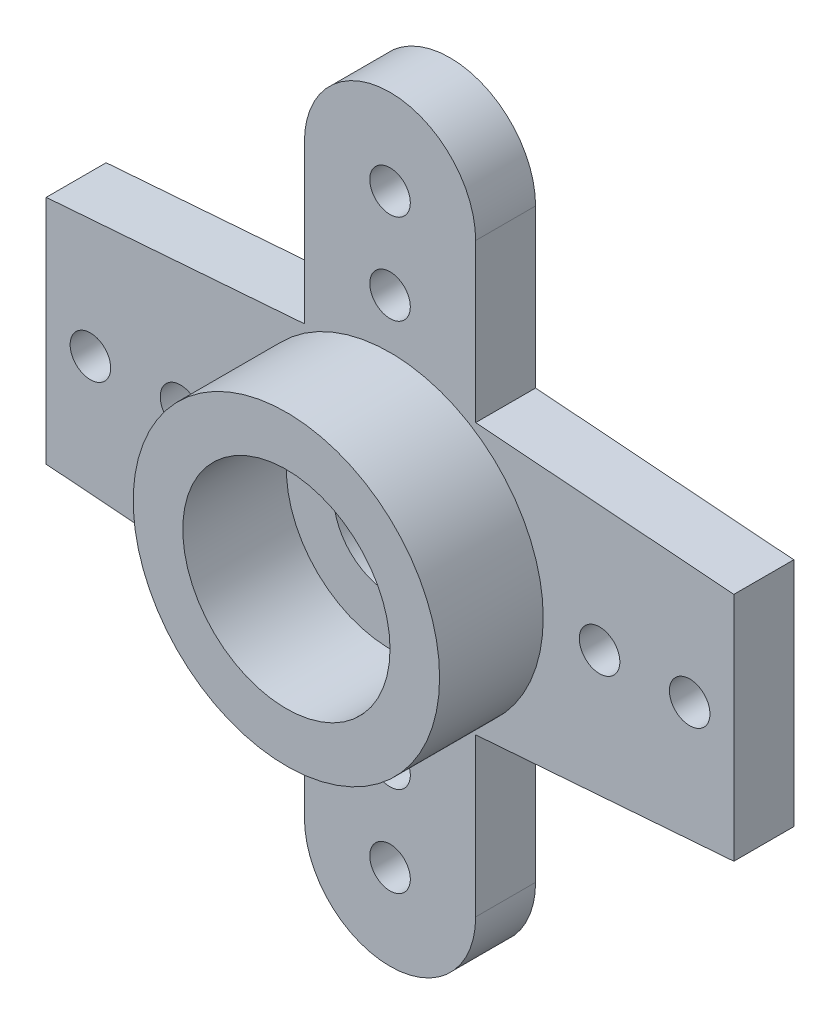
ISO-10303-21;
HEADER;
FILE_DESCRIPTION(('STEP AP214'),'2;1');
FILE_NAME('part.step','',(''),(''),'','','');
FILE_SCHEMA(('AUTOMOTIVE_DESIGN { 1 0 10303 214 1 1 1 1 }'));
ENDSEC;
DATA;
#1=APPLICATION_CONTEXT('core data for automotive mechanical design processes');
#2=APPLICATION_PROTOCOL_DEFINITION('international standard','automotive_design',2000,#1);
#3=PRODUCT_CONTEXT('',#1,'mechanical');
#4=PRODUCT('Part','Part','',(#3));
#5=PRODUCT_RELATED_PRODUCT_CATEGORY('part','',(#4));
#6=PRODUCT_DEFINITION_FORMATION('','',#4);
#7=PRODUCT_DEFINITION_CONTEXT('part definition',#1,'design');
#8=PRODUCT_DEFINITION('design','',#6,#7);
#9=PRODUCT_DEFINITION_SHAPE('','',#8);
#10=(LENGTH_UNIT() NAMED_UNIT(*) SI_UNIT(.MILLI.,.METRE.));
#11=(NAMED_UNIT(*) PLANE_ANGLE_UNIT() SI_UNIT($,.RADIAN.));
#12=(NAMED_UNIT(*) SI_UNIT($,.STERADIAN.) SOLID_ANGLE_UNIT());
#13=UNCERTAINTY_MEASURE_WITH_UNIT(LENGTH_MEASURE(1.E-05),#10,'distance_accuracy_value','');
#14=(GEOMETRIC_REPRESENTATION_CONTEXT(3) GLOBAL_UNCERTAINTY_ASSIGNED_CONTEXT((#13)) GLOBAL_UNIT_ASSIGNED_CONTEXT((#10,
#11,#12)) REPRESENTATION_CONTEXT('',''));
#15=CARTESIAN_POINT('',(0.,0.,0.));
#16=DIRECTION('',(0.,0.,1.));
#17=DIRECTION('',(1.,0.,0.));
#18=AXIS2_PLACEMENT_3D('',#15,#16,#17);
#19=CARTESIAN_POINT('',(0.,0.,0.));
#20=DIRECTION('',(0.,0.,1.));
#21=DIRECTION('',(1.,0.,0.));
#22=AXIS2_PLACEMENT_3D('',#19,#20,#21);
#23=CYLINDRICAL_SURFACE('',#22,1.25);
#24=CARTESIAN_POINT('',(0.,0.,1.33));
#25=DIRECTION('',(0.,0.,1.));
#26=DIRECTION('',(1.,0.,0.));
#27=AXIS2_PLACEMENT_3D('',#24,#25,#26);
#28=CIRCLE('',#27,1.25);
#29=CARTESIAN_POINT('',(1.25,0.,1.33));
#30=VERTEX_POINT('',#29);
#31=EDGE_CURVE('E353',#30,#30,#28,.T.);
#32=ORIENTED_EDGE('',*,*,#31,.T.);
#33=EDGE_LOOP('',(#32));
#34=FACE_BOUND('',#33,.T.);
#35=CARTESIAN_POINT('',(0.,0.,1.1));
#36=DIRECTION('',(0.,0.,-1.));
#37=DIRECTION('',(-1.,0.,0.));
#38=AXIS2_PLACEMENT_3D('',#35,#36,#37);
#39=CIRCLE('',#38,1.25);
#40=CARTESIAN_POINT('',(-1.25,0.,1.1));
#41=VERTEX_POINT('',#40);
#42=EDGE_CURVE('E43',#41,#41,#39,.F.);
#43=ORIENTED_EDGE('',*,*,#42,.F.);
#44=EDGE_LOOP('',(#43));
#45=FACE_BOUND('',#44,.T.);
#46=ADVANCED_FACE('F39',(#34,#45),#23,.F.);
#47=CARTESIAN_POINT('',(-16.7919145803729,-1.86962168683336,1.33));
#48=DIRECTION('',(0.0756877761988721,0.997131566311121,0.));
#49=DIRECTION('',(-0.997131566311121,0.0756877761988721,0.));
#50=AXIS2_PLACEMENT_3D('',#47,#48,#49);
#51=PLANE('',#50);
#52=DIRECTION('',(0.997131566311121,-0.0756877761988721,0.));
#53=VECTOR('',#52,1.);
#54=CARTESIAN_POINT('',(-16.7919145803729,-1.86962168683336,1.33));
#55=LINE('',#54,#53);
#56=CARTESIAN_POINT('',(-7.63066165400287,-2.56501122680907,1.33));
#57=VERTEX_POINT('',#56);
#58=CARTESIAN_POINT('',(-1.90000000000001,-3.,1.33));
#59=VERTEX_POINT('',#58);
#60=EDGE_CURVE('E175',#57,#59,#55,.T.);
#61=ORIENTED_EDGE('',*,*,#60,.F.);
#62=DIRECTION('',(0.,0.,-1.));
#63=VECTOR('',#62,1.);
#64=CARTESIAN_POINT('',(-7.63066165400287,-2.56501122680907,1.33));
#65=LINE('',#64,#63);
#66=CARTESIAN_POINT('',(-7.63066165400287,-2.56501122680907,0.));
#67=VERTEX_POINT('',#66);
#68=EDGE_CURVE('E149',#57,#67,#65,.T.);
#69=ORIENTED_EDGE('',*,*,#68,.T.);
#70=DIRECTION('',(0.997131566311121,-0.0756877761988721,0.));
#71=VECTOR('',#70,1.);
#72=CARTESIAN_POINT('',(-16.7919145803729,-1.86962168683336,0.));
#73=LINE('',#72,#71);
#74=CARTESIAN_POINT('',(-1.90000000000001,-3.,0.));
#75=VERTEX_POINT('',#74);
#76=EDGE_CURVE('E217',#67,#75,#73,.T.);
#77=ORIENTED_EDGE('',*,*,#76,.T.);
#78=DIRECTION('',(0.,0.,-1.));
#79=VECTOR('',#78,1.);
#80=CARTESIAN_POINT('',(-1.90000000000001,-3.,1.33));
#81=LINE('',#80,#79);
#82=EDGE_CURVE('E49',#59,#75,#81,.T.);
#83=ORIENTED_EDGE('',*,*,#82,.F.);
#84=EDGE_LOOP('',(#61,#69,#77,#83));
#85=FACE_BOUND('',#84,.T.);
#86=ADVANCED_FACE('F41',(#85),#51,.F.);
#87=CARTESIAN_POINT('',(-1.90000000000001,-3.,1.33));
#88=DIRECTION('',(1.,0.,0.));
#89=DIRECTION('',(0.,1.,0.));
#90=AXIS2_PLACEMENT_3D('',#87,#88,#89);
#91=PLANE('',#90);
#92=DIRECTION('',(0.,-1.,0.));
#93=VECTOR('',#92,1.);
#94=CARTESIAN_POINT('',(-1.90000000000001,-3.,0.));
#95=LINE('',#94,#93);
#96=CARTESIAN_POINT('',(-1.9,-6.5,0.));
#97=VERTEX_POINT('',#96);
#98=EDGE_CURVE('E211',#75,#97,#95,.T.);
#99=ORIENTED_EDGE('',*,*,#98,.T.);
#100=DIRECTION('',(0.,0.,-1.));
#101=VECTOR('',#100,1.);
#102=CARTESIAN_POINT('',(-1.9,-6.5,1.33));
#103=LINE('',#102,#101);
#104=CARTESIAN_POINT('',(-1.9,-6.5,1.33));
#105=VERTEX_POINT('',#104);
#106=EDGE_CURVE('E200',#105,#97,#103,.T.);
#107=ORIENTED_EDGE('',*,*,#106,.F.);
#108=DIRECTION('',(0.,-1.,0.));
#109=VECTOR('',#108,1.);
#110=CARTESIAN_POINT('',(-1.90000000000001,-3.,1.33));
#111=LINE('',#110,#109);
#112=EDGE_CURVE('E212',#59,#105,#111,.T.);
#113=ORIENTED_EDGE('',*,*,#112,.F.);
#114=ORIENTED_EDGE('',*,*,#82,.T.);
#115=EDGE_LOOP('',(#99,#107,#113,#114));
#116=FACE_BOUND('',#115,.T.);
#117=ADVANCED_FACE('F209',(#116),#91,.F.);
#118=CARTESIAN_POINT('',(0.,-6.5,1.33));
#119=DIRECTION('',(0.,0.,-1.));
#120=DIRECTION('',(-1.,0.,0.));
#121=AXIS2_PLACEMENT_3D('',#118,#119,#120);
#122=CYLINDRICAL_SURFACE('',#121,1.9);
#123=CARTESIAN_POINT('',(0.,-6.5,0.));
#124=DIRECTION('',(0.,0.,1.));
#125=DIRECTION('',(-1.,0.,0.));
#126=AXIS2_PLACEMENT_3D('',#123,#124,#125);
#127=CIRCLE('',#126,1.9);
#128=CARTESIAN_POINT('',(1.9,-6.5,0.));
#129=VERTEX_POINT('',#128);
#130=EDGE_CURVE('E219',#97,#129,#127,.T.);
#131=ORIENTED_EDGE('',*,*,#130,.T.);
#132=DIRECTION('',(0.,0.,-1.));
#133=VECTOR('',#132,1.);
#134=CARTESIAN_POINT('',(1.9,-6.5,1.33));
#135=LINE('',#134,#133);
#136=CARTESIAN_POINT('',(1.9,-6.5,1.33));
#137=VERTEX_POINT('',#136);
#138=EDGE_CURVE('E196',#137,#129,#135,.T.);
#139=ORIENTED_EDGE('',*,*,#138,.F.);
#140=CARTESIAN_POINT('',(0.,-6.5,1.33));
#141=DIRECTION('',(0.,0.,1.));
#142=DIRECTION('',(-1.,0.,0.));
#143=AXIS2_PLACEMENT_3D('',#140,#141,#142);
#144=CIRCLE('',#143,1.9);
#145=EDGE_CURVE('E247',#105,#137,#144,.T.);
#146=ORIENTED_EDGE('',*,*,#145,.F.);
#147=ORIENTED_EDGE('',*,*,#106,.T.);
#148=EDGE_LOOP('',(#131,#139,#146,#147));
#149=FACE_BOUND('',#148,.T.);
#150=ADVANCED_FACE('F374',(#149),#122,.T.);
#151=CARTESIAN_POINT('',(1.89999999999999,-3.,1.33));
#152=DIRECTION('',(-1.,0.,0.));
#153=DIRECTION('',(0.,-1.,0.));
#154=AXIS2_PLACEMENT_3D('',#151,#152,#153);
#155=PLANE('',#154);
#156=DIRECTION('',(0.,1.,0.));
#157=VECTOR('',#156,1.);
#158=CARTESIAN_POINT('',(1.89999999999999,-3.,0.));
#159=LINE('',#158,#157);
#160=CARTESIAN_POINT('',(1.89999999999999,-3.,0.));
#161=VERTEX_POINT('',#160);
#162=EDGE_CURVE('E162',#129,#161,#159,.T.);
#163=ORIENTED_EDGE('',*,*,#162,.T.);
#164=DIRECTION('',(0.,0.,-1.));
#165=VECTOR('',#164,1.);
#166=CARTESIAN_POINT('',(1.89999999999999,-3.,1.33));
#167=LINE('',#166,#165);
#168=CARTESIAN_POINT('',(1.89999999999999,-3.,1.33));
#169=VERTEX_POINT('',#168);
#170=EDGE_CURVE('E192',#169,#161,#167,.T.);
#171=ORIENTED_EDGE('',*,*,#170,.F.);
#172=DIRECTION('',(0.,1.,0.));
#173=VECTOR('',#172,1.);
#174=CARTESIAN_POINT('',(1.89999999999999,-3.,1.33));
#175=LINE('',#174,#173);
#176=EDGE_CURVE('E241',#137,#169,#175,.T.);
#177=ORIENTED_EDGE('',*,*,#176,.F.);
#178=ORIENTED_EDGE('',*,*,#138,.T.);
#179=EDGE_LOOP('',(#163,#171,#177,#178));
#180=FACE_BOUND('',#179,.T.);
#181=ADVANCED_FACE('F231',(#180),#155,.F.);
#182=CARTESIAN_POINT('',(16.7919145803729,-1.86962168683335,1.33));
#183=DIRECTION('',(-0.0756877761988722,0.997131566311121,0.));
#184=DIRECTION('',(-0.997131566311121,-0.0756877761988722,0.));
#185=AXIS2_PLACEMENT_3D('',#182,#183,#184);
#186=PLANE('',#185);
#187=DIRECTION('',(0.997131566311121,0.0756877761988722,0.));
#188=VECTOR('',#187,1.);
#189=CARTESIAN_POINT('',(16.7919145803729,-1.86962168683335,0.));
#190=LINE('',#189,#188);
#191=CARTESIAN_POINT('',(7.63066165400287,-2.56501122680907,0.));
#192=VERTEX_POINT('',#191);
#193=EDGE_CURVE('E156',#161,#192,#190,.T.);
#194=ORIENTED_EDGE('',*,*,#193,.T.);
#195=DIRECTION('',(0.,0.,1.));
#196=VECTOR('',#195,1.);
#197=CARTESIAN_POINT('',(7.63066165400287,-2.56501122680907,1.33));
#198=LINE('',#197,#196);
#199=CARTESIAN_POINT('',(7.63066165400287,-2.56501122680907,1.33));
#200=VERTEX_POINT('',#199);
#201=EDGE_CURVE('E57',#192,#200,#198,.T.);
#202=ORIENTED_EDGE('',*,*,#201,.T.);
#203=DIRECTION('',(0.997131566311121,0.0756877761988722,0.));
#204=VECTOR('',#203,1.);
#205=CARTESIAN_POINT('',(16.7919145803729,-1.86962168683335,1.33));
#206=LINE('',#205,#204);
#207=EDGE_CURVE('E238',#169,#200,#206,.T.);
#208=ORIENTED_EDGE('',*,*,#207,.F.);
#209=ORIENTED_EDGE('',*,*,#170,.T.);
#210=EDGE_LOOP('',(#194,#202,#208,#209));
#211=FACE_BOUND('',#210,.T.);
#212=ADVANCED_FACE('F236',(#211),#186,.F.);
#213=CARTESIAN_POINT('',(16.7919145803729,1.86962168683335,1.33));
#214=DIRECTION('',(-0.0756877761988718,-0.997131566311121,0.));
#215=DIRECTION('',(0.997131566311121,-0.0756877761988718,0.));
#216=AXIS2_PLACEMENT_3D('',#213,#214,#215);
#217=PLANE('',#216);
#218=DIRECTION('',(-0.997131566311121,0.0756877761988718,0.));
#219=VECTOR('',#218,1.);
#220=CARTESIAN_POINT('',(16.7919145803729,1.86962168683335,1.33));
#221=LINE('',#220,#219);
#222=CARTESIAN_POINT('',(7.63066165400287,2.56501122680907,1.33));
#223=VERTEX_POINT('',#222);
#224=CARTESIAN_POINT('',(1.89999999999999,3.,1.33));
#225=VERTEX_POINT('',#224);
#226=EDGE_CURVE('E147',#223,#225,#221,.T.);
#227=ORIENTED_EDGE('',*,*,#226,.F.);
#228=DIRECTION('',(0.,0.,-1.));
#229=VECTOR('',#228,1.);
#230=CARTESIAN_POINT('',(7.63066165400287,2.56501122680907,1.33));
#231=LINE('',#230,#229);
#232=CARTESIAN_POINT('',(7.63066165400287,2.56501122680906,0.));
#233=VERTEX_POINT('',#232);
#234=EDGE_CURVE('E131',#223,#233,#231,.T.);
#235=ORIENTED_EDGE('',*,*,#234,.T.);
#236=DIRECTION('',(-0.997131566311121,0.0756877761988718,0.));
#237=VECTOR('',#236,1.);
#238=CARTESIAN_POINT('',(16.7919145803729,1.86962168683335,0.));
#239=LINE('',#238,#237);
#240=CARTESIAN_POINT('',(1.89999999999999,3.,0.));
#241=VERTEX_POINT('',#240);
#242=EDGE_CURVE('E145',#233,#241,#239,.T.);
#243=ORIENTED_EDGE('',*,*,#242,.T.);
#244=DIRECTION('',(0.,0.,-1.));
#245=VECTOR('',#244,1.);
#246=CARTESIAN_POINT('',(1.89999999999999,3.,1.33));
#247=LINE('',#246,#245);
#248=EDGE_CURVE('E189',#225,#241,#247,.T.);
#249=ORIENTED_EDGE('',*,*,#248,.F.);
#250=EDGE_LOOP('',(#227,#235,#243,#249));
#251=FACE_BOUND('',#250,.T.);
#252=ADVANCED_FACE('F143',(#251),#217,.F.);
#253=CARTESIAN_POINT('',(1.89999999999999,3.,1.33));
#254=DIRECTION('',(-1.,0.,0.));
#255=DIRECTION('',(0.,-1.,0.));
#256=AXIS2_PLACEMENT_3D('',#253,#254,#255);
#257=PLANE('',#256);
#258=DIRECTION('',(0.,1.,0.));
#259=VECTOR('',#258,1.);
#260=CARTESIAN_POINT('',(1.89999999999999,3.,0.));
#261=LINE('',#260,#259);
#262=CARTESIAN_POINT('',(1.9,6.5,0.));
#263=VERTEX_POINT('',#262);
#264=EDGE_CURVE('E154',#241,#263,#261,.T.);
#265=ORIENTED_EDGE('',*,*,#264,.T.);
#266=DIRECTION('',(0.,0.,-1.));
#267=VECTOR('',#266,1.);
#268=CARTESIAN_POINT('',(1.9,6.5,1.33));
#269=LINE('',#268,#267);
#270=CARTESIAN_POINT('',(1.9,6.5,1.33));
#271=VERTEX_POINT('',#270);
#272=EDGE_CURVE('E185',#271,#263,#269,.T.);
#273=ORIENTED_EDGE('',*,*,#272,.F.);
#274=DIRECTION('',(0.,1.,0.));
#275=VECTOR('',#274,1.);
#276=CARTESIAN_POINT('',(1.89999999999999,3.,1.33));
#277=LINE('',#276,#275);
#278=EDGE_CURVE('E245',#225,#271,#277,.T.);
#279=ORIENTED_EDGE('',*,*,#278,.F.);
#280=ORIENTED_EDGE('',*,*,#248,.T.);
#281=EDGE_LOOP('',(#265,#273,#279,#280));
#282=FACE_BOUND('',#281,.T.);
#283=ADVANCED_FACE('F421',(#282),#257,.F.);
#284=CARTESIAN_POINT('',(0.,6.5,1.33));
#285=DIRECTION('',(0.,0.,-1.));
#286=DIRECTION('',(-1.,0.,0.));
#287=AXIS2_PLACEMENT_3D('',#284,#285,#286);
#288=CYLINDRICAL_SURFACE('',#287,1.9);
#289=CARTESIAN_POINT('',(0.,6.5,0.));
#290=DIRECTION('',(0.,0.,1.));
#291=DIRECTION('',(1.,0.,0.));
#292=AXIS2_PLACEMENT_3D('',#289,#290,#291);
#293=CIRCLE('',#292,1.9);
#294=CARTESIAN_POINT('',(-1.9,6.5,0.));
#295=VERTEX_POINT('',#294);
#296=EDGE_CURVE('E160',#263,#295,#293,.T.);
#297=ORIENTED_EDGE('',*,*,#296,.T.);
#298=DIRECTION('',(0.,0.,-1.));
#299=VECTOR('',#298,1.);
#300=CARTESIAN_POINT('',(-1.9,6.5,1.33));
#301=LINE('',#300,#299);
#302=CARTESIAN_POINT('',(-1.9,6.5,1.33));
#303=VERTEX_POINT('',#302);
#304=EDGE_CURVE('E180',#303,#295,#301,.T.);
#305=ORIENTED_EDGE('',*,*,#304,.F.);
#306=CARTESIAN_POINT('',(0.,6.5,1.33));
#307=DIRECTION('',(0.,0.,1.));
#308=DIRECTION('',(1.,0.,0.));
#309=AXIS2_PLACEMENT_3D('',#306,#307,#308);
#310=CIRCLE('',#309,1.9);
#311=EDGE_CURVE('E253',#271,#303,#310,.T.);
#312=ORIENTED_EDGE('',*,*,#311,.F.);
#313=ORIENTED_EDGE('',*,*,#272,.T.);
#314=EDGE_LOOP('',(#297,#305,#312,#313));
#315=FACE_BOUND('',#314,.T.);
#316=ADVANCED_FACE('F417',(#315),#288,.T.);
#317=CARTESIAN_POINT('',(-1.90000000000001,3.,1.33));
#318=DIRECTION('',(1.,0.,0.));
#319=DIRECTION('',(0.,1.,0.));
#320=AXIS2_PLACEMENT_3D('',#317,#318,#319);
#321=PLANE('',#320);
#322=DIRECTION('',(0.,-1.,0.));
#323=VECTOR('',#322,1.);
#324=CARTESIAN_POINT('',(-1.90000000000001,3.,0.));
#325=LINE('',#324,#323);
#326=CARTESIAN_POINT('',(-1.90000000000001,3.,0.));
#327=VERTEX_POINT('',#326);
#328=EDGE_CURVE('E168',#295,#327,#325,.T.);
#329=ORIENTED_EDGE('',*,*,#328,.T.);
#330=DIRECTION('',(0.,0.,-1.));
#331=VECTOR('',#330,1.);
#332=CARTESIAN_POINT('',(-1.90000000000001,3.,1.33));
#333=LINE('',#332,#331);
#334=CARTESIAN_POINT('',(-1.90000000000001,3.,1.33));
#335=VERTEX_POINT('',#334);
#336=EDGE_CURVE('E176',#335,#327,#333,.T.);
#337=ORIENTED_EDGE('',*,*,#336,.F.);
#338=DIRECTION('',(0.,-1.,0.));
#339=VECTOR('',#338,1.);
#340=CARTESIAN_POINT('',(-1.90000000000001,3.,1.33));
#341=LINE('',#340,#339);
#342=EDGE_CURVE('E256',#303,#335,#341,.T.);
#343=ORIENTED_EDGE('',*,*,#342,.F.);
#344=ORIENTED_EDGE('',*,*,#304,.T.);
#345=EDGE_LOOP('',(#329,#337,#343,#344));
#346=FACE_BOUND('',#345,.T.);
#347=ADVANCED_FACE('F414',(#346),#321,.F.);
#348=CARTESIAN_POINT('',(-16.7919145803729,1.86962168683335,1.33));
#349=DIRECTION('',(0.0756877761988721,-0.997131566311121,0.));
#350=DIRECTION('',(0.997131566311121,0.0756877761988721,0.));
#351=AXIS2_PLACEMENT_3D('',#348,#349,#350);
#352=PLANE('',#351);
#353=DIRECTION('',(-0.997131566311121,-0.0756877761988721,0.));
#354=VECTOR('',#353,1.);
#355=CARTESIAN_POINT('',(-16.7919145803729,1.86962168683335,0.));
#356=LINE('',#355,#354);
#357=CARTESIAN_POINT('',(-7.63066165400287,2.56501122680906,0.));
#358=VERTEX_POINT('',#357);
#359=EDGE_CURVE('E171',#327,#358,#356,.T.);
#360=ORIENTED_EDGE('',*,*,#359,.T.);
#361=DIRECTION('',(0.,0.,1.));
#362=VECTOR('',#361,1.);
#363=CARTESIAN_POINT('',(-7.63066165400287,2.56501122680906,1.33));
#364=LINE('',#363,#362);
#365=CARTESIAN_POINT('',(-7.63066165400287,2.56501122680906,1.33));
#366=VERTEX_POINT('',#365);
#367=EDGE_CURVE('E65',#358,#366,#364,.T.);
#368=ORIENTED_EDGE('',*,*,#367,.T.);
#369=DIRECTION('',(-0.997131566311121,-0.0756877761988721,0.));
#370=VECTOR('',#369,1.);
#371=CARTESIAN_POINT('',(-16.7919145803729,1.86962168683335,1.33));
#372=LINE('',#371,#370);
#373=EDGE_CURVE('E181',#335,#366,#372,.T.);
#374=ORIENTED_EDGE('',*,*,#373,.F.);
#375=ORIENTED_EDGE('',*,*,#336,.T.);
#376=EDGE_LOOP('',(#360,#368,#374,#375));
#377=FACE_BOUND('',#376,.T.);
#378=ADVANCED_FACE('F267',(#377),#352,.F.);
#379=CARTESIAN_POINT('',(-16.65,0.,1.33));
#380=DIRECTION('',(0.,0.,1.));
#381=DIRECTION('',(1.,0.,0.));
#382=AXIS2_PLACEMENT_3D('',#379,#380,#381);
#383=PLANE('',#382);
#384=DIRECTION('',(0.,1.,0.));
#385=VECTOR('',#384,1.);
#386=CARTESIAN_POINT('',(7.63066165400287,-0.0695003417725334,1.33));
#387=LINE('',#386,#385);
#388=EDGE_CURVE('E138',#200,#223,#387,.T.);
#389=ORIENTED_EDGE('',*,*,#388,.T.);
#390=ORIENTED_EDGE('',*,*,#226,.T.);
#391=ORIENTED_EDGE('',*,*,#278,.T.);
#392=ORIENTED_EDGE('',*,*,#311,.T.);
#393=ORIENTED_EDGE('',*,*,#342,.T.);
#394=ORIENTED_EDGE('',*,*,#373,.T.);
#395=DIRECTION('',(0.,-1.,0.));
#396=VECTOR('',#395,1.);
#397=CARTESIAN_POINT('',(-7.63066165400287,-4.01865818135767,1.33));
#398=LINE('',#397,#396);
#399=EDGE_CURVE('E139',#366,#57,#398,.T.);
#400=ORIENTED_EDGE('',*,*,#399,.T.);
#401=ORIENTED_EDGE('',*,*,#60,.T.);
#402=ORIENTED_EDGE('',*,*,#112,.T.);
#403=ORIENTED_EDGE('',*,*,#145,.T.);
#404=ORIENTED_EDGE('',*,*,#176,.T.);
#405=ORIENTED_EDGE('',*,*,#207,.T.);
#406=EDGE_LOOP('',(#389,#390,#391,#392,#393,#394,#400,#401,#402,#403,#404,#405));
#407=FACE_BOUND('',#406,.T.);
#408=CARTESIAN_POINT('',(0.,6.5,1.33));
#409=DIRECTION('',(0.,0.,1.));
#410=DIRECTION('',(1.,0.,0.));
#411=AXIS2_PLACEMENT_3D('',#408,#409,#410);
#412=CIRCLE('',#411,0.45);
#413=CARTESIAN_POINT('',(0.449999999999998,6.5,1.33));
#414=VERTEX_POINT('',#413);
#415=EDGE_CURVE('E287',#414,#414,#412,.T.);
#416=ORIENTED_EDGE('',*,*,#415,.F.);
#417=EDGE_LOOP('',(#416));
#418=FACE_BOUND('',#417,.T.);
#419=CARTESIAN_POINT('',(6.65,0.,1.33));
#420=DIRECTION('',(0.,0.,1.));
#421=DIRECTION('',(-1.,0.,0.));
#422=AXIS2_PLACEMENT_3D('',#419,#420,#421);
#423=CIRCLE('',#422,0.449999999999998);
#424=CARTESIAN_POINT('',(6.20000000000001,0.,1.33));
#425=VERTEX_POINT('',#424);
#426=EDGE_CURVE('E281',#425,#425,#423,.T.);
#427=ORIENTED_EDGE('',*,*,#426,.F.);
#428=EDGE_LOOP('',(#427));
#429=FACE_BOUND('',#428,.T.);
#430=CARTESIAN_POINT('',(4.65,0.,1.33));
#431=DIRECTION('',(0.,0.,1.));
#432=DIRECTION('',(-1.,0.,0.));
#433=AXIS2_PLACEMENT_3D('',#430,#431,#432);
#434=CIRCLE('',#433,0.449999999999998);
#435=CARTESIAN_POINT('',(4.20000000000001,0.,1.33));
#436=VERTEX_POINT('',#435);
#437=EDGE_CURVE('E313',#436,#436,#434,.T.);
#438=ORIENTED_EDGE('',*,*,#437,.F.);
#439=EDGE_LOOP('',(#438));
#440=FACE_BOUND('',#439,.T.);
#441=CARTESIAN_POINT('',(0.,-6.5,1.33));
#442=DIRECTION('',(0.,0.,1.));
#443=DIRECTION('',(-1.,0.,0.));
#444=AXIS2_PLACEMENT_3D('',#441,#442,#443);
#445=CIRCLE('',#444,0.45);
#446=CARTESIAN_POINT('',(-0.449999999999997,-6.5,1.33));
#447=VERTEX_POINT('',#446);
#448=EDGE_CURVE('E305',#447,#447,#445,.T.);
#449=ORIENTED_EDGE('',*,*,#448,.F.);
#450=EDGE_LOOP('',(#449));
#451=FACE_BOUND('',#450,.T.);
#452=CARTESIAN_POINT('',(0.,-4.5,1.33));
#453=DIRECTION('',(0.,0.,1.));
#454=DIRECTION('',(-1.,0.,0.));
#455=AXIS2_PLACEMENT_3D('',#452,#453,#454);
#456=CIRCLE('',#455,0.45);
#457=CARTESIAN_POINT('',(-0.449999999999978,-4.5,1.33));
#458=VERTEX_POINT('',#457);
#459=EDGE_CURVE('E297',#458,#458,#456,.T.);
#460=ORIENTED_EDGE('',*,*,#459,.F.);
#461=EDGE_LOOP('',(#460));
#462=FACE_BOUND('',#461,.T.);
#463=CARTESIAN_POINT('',(0.,4.5,1.33));
#464=DIRECTION('',(0.,0.,1.));
#465=DIRECTION('',(1.,0.,0.));
#466=AXIS2_PLACEMENT_3D('',#463,#464,#465);
#467=CIRCLE('',#466,0.45);
#468=CARTESIAN_POINT('',(0.450000000000019,4.5,1.33));
#469=VERTEX_POINT('',#468);
#470=EDGE_CURVE('E328',#469,#469,#467,.T.);
#471=ORIENTED_EDGE('',*,*,#470,.F.);
#472=EDGE_LOOP('',(#471));
#473=FACE_BOUND('',#472,.T.);
#474=CARTESIAN_POINT('',(-6.65,0.,1.33));
#475=DIRECTION('',(0.,0.,1.));
#476=DIRECTION('',(1.,0.,0.));
#477=AXIS2_PLACEMENT_3D('',#474,#475,#476);
#478=CIRCLE('',#477,0.449999999999998);
#479=CARTESIAN_POINT('',(-6.20000000000001,0.,1.33));
#480=VERTEX_POINT('',#479);
#481=EDGE_CURVE('E329',#480,#480,#478,.T.);
#482=ORIENTED_EDGE('',*,*,#481,.F.);
#483=EDGE_LOOP('',(#482));
#484=FACE_BOUND('',#483,.T.);
#485=CARTESIAN_POINT('',(-4.65,0.,1.33));
#486=DIRECTION('',(0.,0.,1.));
#487=DIRECTION('',(1.,0.,0.));
#488=AXIS2_PLACEMENT_3D('',#485,#486,#487);
#489=CIRCLE('',#488,0.449999999999998);
#490=CARTESIAN_POINT('',(-4.20000000000001,0.,1.33));
#491=VERTEX_POINT('',#490);
#492=EDGE_CURVE('E296',#491,#491,#489,.T.);
#493=ORIENTED_EDGE('',*,*,#492,.F.);
#494=EDGE_LOOP('',(#493));
#495=FACE_BOUND('',#494,.T.);
#496=CARTESIAN_POINT('',(0.,0.,1.33));
#497=DIRECTION('',(0.,0.,1.));
#498=DIRECTION('',(1.,0.,0.));
#499=AXIS2_PLACEMENT_3D('',#496,#497,#498);
#500=CIRCLE('',#499,3.4);
#501=CARTESIAN_POINT('',(3.4,0.,1.33));
#502=VERTEX_POINT('',#501);
#503=EDGE_CURVE('E11',#502,#502,#500,.T.);
#504=ORIENTED_EDGE('',*,*,#503,.F.);
#505=EDGE_LOOP('',(#504));
#506=FACE_BOUND('',#505,.T.);
#507=ADVANCED_FACE('F262',(#407,#418,#429,#440,#451,#462,#473,#484,#495,#506),#383,.T.);
#508=CARTESIAN_POINT('',(-16.65,0.,0.));
#509=DIRECTION('',(0.,0.,1.));
#510=DIRECTION('',(1.,0.,0.));
#511=AXIS2_PLACEMENT_3D('',#508,#509,#510);
#512=PLANE('',#511);
#513=CARTESIAN_POINT('',(0.,6.5,0.));
#514=DIRECTION('',(0.,0.,1.));
#515=DIRECTION('',(1.,0.,0.));
#516=AXIS2_PLACEMENT_3D('',#513,#514,#515);
#517=CIRCLE('',#516,0.45);
#518=CARTESIAN_POINT('',(0.449999999999998,6.5,0.));
#519=VERTEX_POINT('',#518);
#520=EDGE_CURVE('E282',#519,#519,#517,.T.);
#521=ORIENTED_EDGE('',*,*,#520,.T.);
#522=EDGE_LOOP('',(#521));
#523=FACE_BOUND('',#522,.T.);
#524=CARTESIAN_POINT('',(6.65,0.,0.));
#525=DIRECTION('',(0.,0.,1.));
#526=DIRECTION('',(-1.,0.,0.));
#527=AXIS2_PLACEMENT_3D('',#524,#525,#526);
#528=CIRCLE('',#527,0.449999999999998);
#529=CARTESIAN_POINT('',(6.20000000000001,0.,0.));
#530=VERTEX_POINT('',#529);
#531=EDGE_CURVE('E317',#530,#530,#528,.T.);
#532=ORIENTED_EDGE('',*,*,#531,.T.);
#533=EDGE_LOOP('',(#532));
#534=FACE_BOUND('',#533,.T.);
#535=CARTESIAN_POINT('',(4.65,0.,0.));
#536=DIRECTION('',(0.,0.,1.));
#537=DIRECTION('',(-1.,0.,0.));
#538=AXIS2_PLACEMENT_3D('',#535,#536,#537);
#539=CIRCLE('',#538,0.449999999999998);
#540=CARTESIAN_POINT('',(4.20000000000001,0.,0.));
#541=VERTEX_POINT('',#540);
#542=EDGE_CURVE('E309',#541,#541,#539,.T.);
#543=ORIENTED_EDGE('',*,*,#542,.T.);
#544=EDGE_LOOP('',(#543));
#545=FACE_BOUND('',#544,.T.);
#546=CARTESIAN_POINT('',(0.,-6.5,0.));
#547=DIRECTION('',(0.,0.,1.));
#548=DIRECTION('',(-1.,0.,0.));
#549=AXIS2_PLACEMENT_3D('',#546,#547,#548);
#550=CIRCLE('',#549,0.45);
#551=CARTESIAN_POINT('',(-0.449999999999997,-6.5,0.));
#552=VERTEX_POINT('',#551);
#553=EDGE_CURVE('E301',#552,#552,#550,.T.);
#554=ORIENTED_EDGE('',*,*,#553,.T.);
#555=EDGE_LOOP('',(#554));
#556=FACE_BOUND('',#555,.T.);
#557=CARTESIAN_POINT('',(0.,-4.5,0.));
#558=DIRECTION('',(0.,0.,1.));
#559=DIRECTION('',(-1.,0.,0.));
#560=AXIS2_PLACEMENT_3D('',#557,#558,#559);
#561=CIRCLE('',#560,0.45);
#562=CARTESIAN_POINT('',(-0.449999999999978,-4.5,0.));
#563=VERTEX_POINT('',#562);
#564=EDGE_CURVE('E292',#563,#563,#561,.T.);
#565=ORIENTED_EDGE('',*,*,#564,.T.);
#566=EDGE_LOOP('',(#565));
#567=FACE_BOUND('',#566,.T.);
#568=CARTESIAN_POINT('',(0.,4.5,0.));
#569=DIRECTION('',(0.,0.,1.));
#570=DIRECTION('',(1.,0.,0.));
#571=AXIS2_PLACEMENT_3D('',#568,#569,#570);
#572=CIRCLE('',#571,0.45);
#573=CARTESIAN_POINT('',(0.450000000000019,4.5,0.));
#574=VERTEX_POINT('',#573);
#575=EDGE_CURVE('E291',#574,#574,#572,.T.);
#576=ORIENTED_EDGE('',*,*,#575,.T.);
#577=EDGE_LOOP('',(#576));
#578=FACE_BOUND('',#577,.T.);
#579=CARTESIAN_POINT('',(-6.65,0.,0.));
#580=DIRECTION('',(0.,0.,1.));
#581=DIRECTION('',(1.,0.,0.));
#582=AXIS2_PLACEMENT_3D('',#579,#580,#581);
#583=CIRCLE('',#582,0.449999999999998);
#584=CARTESIAN_POINT('',(-6.20000000000001,0.,0.));
#585=VERTEX_POINT('',#584);
#586=EDGE_CURVE('E324',#585,#585,#583,.T.);
#587=ORIENTED_EDGE('',*,*,#586,.T.);
#588=EDGE_LOOP('',(#587));
#589=FACE_BOUND('',#588,.T.);
#590=CARTESIAN_POINT('',(-4.65,0.,0.));
#591=DIRECTION('',(0.,0.,1.));
#592=DIRECTION('',(1.,0.,0.));
#593=AXIS2_PLACEMENT_3D('',#590,#591,#592);
#594=CIRCLE('',#593,0.449999999999998);
#595=CARTESIAN_POINT('',(-4.20000000000001,0.,0.));
#596=VERTEX_POINT('',#595);
#597=EDGE_CURVE('E333',#596,#596,#594,.T.);
#598=ORIENTED_EDGE('',*,*,#597,.T.);
#599=EDGE_LOOP('',(#598));
#600=FACE_BOUND('',#599,.T.);
#601=CARTESIAN_POINT('',(0.,0.,0.));
#602=DIRECTION('',(0.,0.,-1.));
#603=DIRECTION('',(-1.,0.,0.));
#604=AXIS2_PLACEMENT_3D('',#601,#602,#603);
#605=CIRCLE('',#604,2.35);
#606=CARTESIAN_POINT('',(-2.35,0.,0.));
#607=VERTEX_POINT('',#606);
#608=EDGE_CURVE('E286',#607,#607,#605,.T.);
#609=ORIENTED_EDGE('',*,*,#608,.F.);
#610=EDGE_LOOP('',(#609));
#611=FACE_BOUND('',#610,.T.);
#612=ORIENTED_EDGE('',*,*,#242,.F.);
#613=DIRECTION('',(0.,1.,0.));
#614=VECTOR('',#613,1.);
#615=CARTESIAN_POINT('',(7.63066165400287,-0.0695003417725334,0.));
#616=LINE('',#615,#614);
#617=EDGE_CURVE('E128',#192,#233,#616,.T.);
#618=ORIENTED_EDGE('',*,*,#617,.F.);
#619=ORIENTED_EDGE('',*,*,#193,.F.);
#620=ORIENTED_EDGE('',*,*,#162,.F.);
#621=ORIENTED_EDGE('',*,*,#130,.F.);
#622=ORIENTED_EDGE('',*,*,#98,.F.);
#623=ORIENTED_EDGE('',*,*,#76,.F.);
#624=DIRECTION('',(0.,-1.,0.));
#625=VECTOR('',#624,1.);
#626=CARTESIAN_POINT('',(-7.63066165400287,-4.01865818135767,0.));
#627=LINE('',#626,#625);
#628=EDGE_CURVE('E705',#358,#67,#627,.T.);
#629=ORIENTED_EDGE('',*,*,#628,.F.);
#630=ORIENTED_EDGE('',*,*,#359,.F.);
#631=ORIENTED_EDGE('',*,*,#328,.F.);
#632=ORIENTED_EDGE('',*,*,#296,.F.);
#633=ORIENTED_EDGE('',*,*,#264,.F.);
#634=EDGE_LOOP('',(#612,#618,#619,#620,#621,#622,#623,#629,#630,#631,#632,#633));
#635=FACE_BOUND('',#634,.T.);
#636=ADVANCED_FACE('F152',(#523,#534,#545,#556,#567,#578,#589,#600,#611,#635),#512,.F.);
#637=CARTESIAN_POINT('',(0.,0.,-9.61665222413705));
#638=DIRECTION('',(0.,0.,1.));
#639=DIRECTION('',(1.,0.,0.));
#640=AXIS2_PLACEMENT_3D('',#637,#638,#639);
#641=CYLINDRICAL_SURFACE('',#640,3.4);
#642=ORIENTED_EDGE('',*,*,#503,.T.);
#643=EDGE_LOOP('',(#642));
#644=FACE_BOUND('',#643,.T.);
#645=CARTESIAN_POINT('',(0.,0.,3.63));
#646=DIRECTION('',(0.,0.,1.));
#647=DIRECTION('',(1.,0.,0.));
#648=AXIS2_PLACEMENT_3D('',#645,#646,#647);
#649=CIRCLE('',#648,3.4);
#650=CARTESIAN_POINT('',(3.4,0.,3.63));
#651=VERTEX_POINT('',#650);
#652=EDGE_CURVE('E361',#651,#651,#649,.T.);
#653=ORIENTED_EDGE('',*,*,#652,.F.);
#654=EDGE_LOOP('',(#653));
#655=FACE_BOUND('',#654,.T.);
#656=ADVANCED_FACE('F402',(#644,#655),#641,.T.);
#657=CARTESIAN_POINT('',(0.,0.,-9.61665222413705));
#658=DIRECTION('',(0.,0.,1.));
#659=DIRECTION('',(1.,0.,0.));
#660=AXIS2_PLACEMENT_3D('',#657,#658,#659);
#661=CYLINDRICAL_SURFACE('',#660,2.3);
#662=CARTESIAN_POINT('',(0.,0.,1.33));
#663=DIRECTION('',(0.,0.,1.));
#664=DIRECTION('',(1.,0.,0.));
#665=AXIS2_PLACEMENT_3D('',#662,#663,#664);
#666=CIRCLE('',#665,2.3);
#667=CARTESIAN_POINT('',(2.3,0.,1.33));
#668=VERTEX_POINT('',#667);
#669=EDGE_CURVE('E225',#668,#668,#666,.T.);
#670=ORIENTED_EDGE('',*,*,#669,.F.);
#671=EDGE_LOOP('',(#670));
#672=FACE_BOUND('',#671,.T.);
#673=CARTESIAN_POINT('',(0.,0.,3.63));
#674=DIRECTION('',(0.,0.,1.));
#675=DIRECTION('',(1.,0.,0.));
#676=AXIS2_PLACEMENT_3D('',#673,#674,#675);
#677=CIRCLE('',#676,2.3);
#678=CARTESIAN_POINT('',(2.3,0.,3.63));
#679=VERTEX_POINT('',#678);
#680=EDGE_CURVE('E357',#679,#679,#677,.T.);
#681=ORIENTED_EDGE('',*,*,#680,.T.);
#682=EDGE_LOOP('',(#681));
#683=FACE_BOUND('',#682,.T.);
#684=ADVANCED_FACE('F398',(#672,#683),#661,.F.);
#685=CARTESIAN_POINT('',(0.,0.,3.63));
#686=DIRECTION('',(0.,0.,1.));
#687=DIRECTION('',(1.,0.,0.));
#688=AXIS2_PLACEMENT_3D('',#685,#686,#687);
#689=PLANE('',#688);
#690=ORIENTED_EDGE('',*,*,#652,.T.);
#691=EDGE_LOOP('',(#690));
#692=FACE_BOUND('',#691,.T.);
#693=ORIENTED_EDGE('',*,*,#680,.F.);
#694=EDGE_LOOP('',(#693));
#695=FACE_BOUND('',#694,.T.);
#696=ADVANCED_FACE('F394',(#692,#695),#689,.T.);
#697=ORIENTED_EDGE('',*,*,#31,.F.);
#698=EDGE_LOOP('',(#697));
#699=FACE_BOUND('',#698,.T.);
#700=ORIENTED_EDGE('',*,*,#669,.T.);
#701=EDGE_LOOP('',(#700));
#702=FACE_BOUND('',#701,.T.);
#703=ADVANCED_FACE('F397',(#699,#702),#383,.T.);
#704=CARTESIAN_POINT('',(0.,0.,1.1));
#705=DIRECTION('',(0.,0.,-1.));
#706=DIRECTION('',(-1.,0.,0.));
#707=AXIS2_PLACEMENT_3D('',#704,#705,#706);
#708=PLANE('',#707);
#709=CARTESIAN_POINT('',(0.,0.,1.1));
#710=DIRECTION('',(0.,0.,-1.));
#711=DIRECTION('',(-1.,0.,0.));
#712=AXIS2_PLACEMENT_3D('',#709,#710,#711);
#713=CIRCLE('',#712,2.35);
#714=CARTESIAN_POINT('',(-2.35,0.,1.1));
#715=VERTEX_POINT('',#714);
#716=EDGE_CURVE('E346',#715,#715,#713,.T.);
#717=ORIENTED_EDGE('',*,*,#716,.T.);
#718=EDGE_LOOP('',(#717));
#719=FACE_BOUND('',#718,.T.);
#720=ORIENTED_EDGE('',*,*,#42,.T.);
#721=EDGE_LOOP('',(#720));
#722=FACE_BOUND('',#721,.T.);
#723=ADVANCED_FACE('F504',(#719,#722),#708,.T.);
#724=CARTESIAN_POINT('',(0.,0.,1.1));
#725=DIRECTION('',(0.,0.,-1.));
#726=DIRECTION('',(-1.,0.,0.));
#727=AXIS2_PLACEMENT_3D('',#724,#725,#726);
#728=CYLINDRICAL_SURFACE('',#727,2.35);
#729=ORIENTED_EDGE('',*,*,#716,.F.);
#730=EDGE_LOOP('',(#729));
#731=FACE_BOUND('',#730,.T.);
#732=ORIENTED_EDGE('',*,*,#608,.T.);
#733=EDGE_LOOP('',(#732));
#734=FACE_BOUND('',#733,.T.);
#735=ADVANCED_FACE('F392',(#731,#734),#728,.F.);
#736=CARTESIAN_POINT('',(-4.65,0.,0.));
#737=DIRECTION('',(0.,0.,1.));
#738=DIRECTION('',(1.,0.,0.));
#739=AXIS2_PLACEMENT_3D('',#736,#737,#738);
#740=CYLINDRICAL_SURFACE('',#739,0.449999999999998);
#741=ORIENTED_EDGE('',*,*,#597,.F.);
#742=EDGE_LOOP('',(#741));
#743=FACE_BOUND('',#742,.T.);
#744=ORIENTED_EDGE('',*,*,#492,.T.);
#745=EDGE_LOOP('',(#744));
#746=FACE_BOUND('',#745,.T.);
#747=ADVANCED_FACE('F497',(#743,#746),#740,.F.);
#748=CARTESIAN_POINT('',(-6.65,0.,0.));
#749=DIRECTION('',(0.,0.,1.));
#750=DIRECTION('',(1.,0.,0.));
#751=AXIS2_PLACEMENT_3D('',#748,#749,#750);
#752=CYLINDRICAL_SURFACE('',#751,0.449999999999998);
#753=ORIENTED_EDGE('',*,*,#586,.F.);
#754=EDGE_LOOP('',(#753));
#755=FACE_BOUND('',#754,.T.);
#756=ORIENTED_EDGE('',*,*,#481,.T.);
#757=EDGE_LOOP('',(#756));
#758=FACE_BOUND('',#757,.T.);
#759=ADVANCED_FACE('F494',(#755,#758),#752,.F.);
#760=CARTESIAN_POINT('',(0.,4.5,0.));
#761=DIRECTION('',(0.,0.,1.));
#762=DIRECTION('',(1.,0.,0.));
#763=AXIS2_PLACEMENT_3D('',#760,#761,#762);
#764=CYLINDRICAL_SURFACE('',#763,0.45);
#765=ORIENTED_EDGE('',*,*,#575,.F.);
#766=EDGE_LOOP('',(#765));
#767=FACE_BOUND('',#766,.T.);
#768=ORIENTED_EDGE('',*,*,#470,.T.);
#769=EDGE_LOOP('',(#768));
#770=FACE_BOUND('',#769,.T.);
#771=ADVANCED_FACE('F482',(#767,#770),#764,.F.);
#772=CARTESIAN_POINT('',(0.,-4.5,0.));
#773=DIRECTION('',(0.,0.,1.));
#774=DIRECTION('',(1.,0.,0.));
#775=AXIS2_PLACEMENT_3D('',#772,#773,#774);
#776=CYLINDRICAL_SURFACE('',#775,0.45);
#777=ORIENTED_EDGE('',*,*,#564,.F.);
#778=EDGE_LOOP('',(#777));
#779=FACE_BOUND('',#778,.T.);
#780=ORIENTED_EDGE('',*,*,#459,.T.);
#781=EDGE_LOOP('',(#780));
#782=FACE_BOUND('',#781,.T.);
#783=ADVANCED_FACE('F478',(#779,#782),#776,.F.);
#784=CARTESIAN_POINT('',(0.,-6.5,0.));
#785=DIRECTION('',(0.,0.,1.));
#786=DIRECTION('',(1.,0.,0.));
#787=AXIS2_PLACEMENT_3D('',#784,#785,#786);
#788=CYLINDRICAL_SURFACE('',#787,0.45);
#789=ORIENTED_EDGE('',*,*,#553,.F.);
#790=EDGE_LOOP('',(#789));
#791=FACE_BOUND('',#790,.T.);
#792=ORIENTED_EDGE('',*,*,#448,.T.);
#793=EDGE_LOOP('',(#792));
#794=FACE_BOUND('',#793,.T.);
#795=ADVANCED_FACE('F481',(#791,#794),#788,.F.);
#796=CARTESIAN_POINT('',(4.65,0.,0.));
#797=DIRECTION('',(0.,0.,1.));
#798=DIRECTION('',(1.,0.,0.));
#799=AXIS2_PLACEMENT_3D('',#796,#797,#798);
#800=CYLINDRICAL_SURFACE('',#799,0.449999999999998);
#801=ORIENTED_EDGE('',*,*,#542,.F.);
#802=EDGE_LOOP('',(#801));
#803=FACE_BOUND('',#802,.T.);
#804=ORIENTED_EDGE('',*,*,#437,.T.);
#805=EDGE_LOOP('',(#804));
#806=FACE_BOUND('',#805,.T.);
#807=ADVANCED_FACE('F486',(#803,#806),#800,.F.);
#808=CARTESIAN_POINT('',(6.65,0.,0.));
#809=DIRECTION('',(0.,0.,1.));
#810=DIRECTION('',(1.,0.,0.));
#811=AXIS2_PLACEMENT_3D('',#808,#809,#810);
#812=CYLINDRICAL_SURFACE('',#811,0.449999999999998);
#813=ORIENTED_EDGE('',*,*,#531,.F.);
#814=EDGE_LOOP('',(#813));
#815=FACE_BOUND('',#814,.T.);
#816=ORIENTED_EDGE('',*,*,#426,.T.);
#817=EDGE_LOOP('',(#816));
#818=FACE_BOUND('',#817,.T.);
#819=ADVANCED_FACE('F476',(#815,#818),#812,.F.);
#820=CARTESIAN_POINT('',(0.,6.5,0.));
#821=DIRECTION('',(0.,0.,1.));
#822=DIRECTION('',(1.,0.,0.));
#823=AXIS2_PLACEMENT_3D('',#820,#821,#822);
#824=CYLINDRICAL_SURFACE('',#823,0.45);
#825=ORIENTED_EDGE('',*,*,#520,.F.);
#826=EDGE_LOOP('',(#825));
#827=FACE_BOUND('',#826,.T.);
#828=ORIENTED_EDGE('',*,*,#415,.T.);
#829=EDGE_LOOP('',(#828));
#830=FACE_BOUND('',#829,.T.);
#831=ADVANCED_FACE('F457',(#827,#830),#824,.F.);
#832=CARTESIAN_POINT('',(-7.63066165400287,-4.01865818135767,16.235539785311));
#833=DIRECTION('',(1.,0.,0.));
#834=DIRECTION('',(0.,0.,-1.));
#835=AXIS2_PLACEMENT_3D('',#832,#833,#834);
#836=PLANE('',#835);
#837=ORIENTED_EDGE('',*,*,#399,.F.);
#838=ORIENTED_EDGE('',*,*,#367,.F.);
#839=ORIENTED_EDGE('',*,*,#628,.T.);
#840=ORIENTED_EDGE('',*,*,#68,.F.);
#841=EDGE_LOOP('',(#837,#838,#839,#840));
#842=FACE_BOUND('',#841,.T.);
#843=ADVANCED_FACE('F452',(#842),#836,.F.);
#844=CARTESIAN_POINT('',(7.63066165400287,-0.0695003417725334,16.235539785311));
#845=DIRECTION('',(-1.,0.,0.));
#846=DIRECTION('',(0.,0.,1.));
#847=AXIS2_PLACEMENT_3D('',#844,#845,#846);
#848=PLANE('',#847);
#849=ORIENTED_EDGE('',*,*,#617,.T.);
#850=ORIENTED_EDGE('',*,*,#234,.F.);
#851=ORIENTED_EDGE('',*,*,#388,.F.);
#852=ORIENTED_EDGE('',*,*,#201,.F.);
#853=EDGE_LOOP('',(#849,#850,#851,#852));
#854=FACE_BOUND('',#853,.T.);
#855=ADVANCED_FACE('F130',(#854),#848,.F.);
#856=CLOSED_SHELL('',(#46,#86,#117,#150,#181,#212,#252,#283,#316,#347,#378,#507,#636,#656,#684,
#696,#703,#723,#735,#747,#759,#771,#783,#795,#807,#819,#831,#843,#855));
#857=MANIFOLD_SOLID_BREP('B2',#856);
#858=ADVANCED_BREP_SHAPE_REPRESENTATION('',(#18,#857),#14);
#859=SHAPE_DEFINITION_REPRESENTATION(#9,#858);
ENDSEC;
END-ISO-10303-21;
